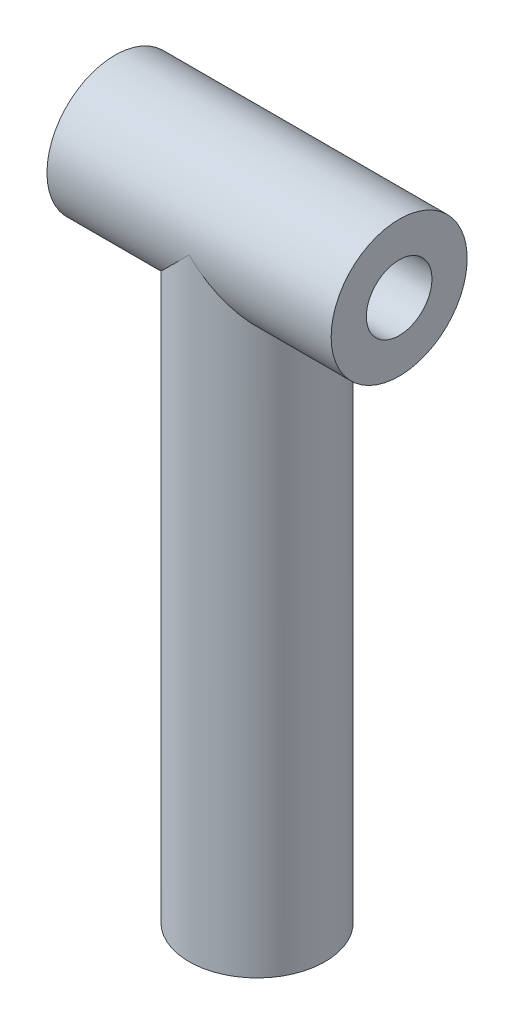
ISO-10303-21;
HEADER;
FILE_DESCRIPTION(('STEP AP214'),'2;1');
FILE_NAME('part.step','',(''),(''),'','','');
FILE_SCHEMA(('AUTOMOTIVE_DESIGN { 1 0 10303 214 1 1 1 1 }'));
ENDSEC;
DATA;
#1=APPLICATION_CONTEXT('core data for automotive mechanical design processes');
#2=APPLICATION_PROTOCOL_DEFINITION('international standard','automotive_design',2000,#1);
#3=PRODUCT_CONTEXT('',#1,'mechanical');
#4=PRODUCT('Part','Part','',(#3));
#5=PRODUCT_RELATED_PRODUCT_CATEGORY('part','',(#4));
#6=PRODUCT_DEFINITION_FORMATION('','',#4);
#7=PRODUCT_DEFINITION_CONTEXT('part definition',#1,'design');
#8=PRODUCT_DEFINITION('design','',#6,#7);
#9=PRODUCT_DEFINITION_SHAPE('','',#8);
#10=(LENGTH_UNIT() NAMED_UNIT(*) SI_UNIT(.MILLI.,.METRE.));
#11=(NAMED_UNIT(*) PLANE_ANGLE_UNIT() SI_UNIT($,.RADIAN.));
#12=(NAMED_UNIT(*) SI_UNIT($,.STERADIAN.) SOLID_ANGLE_UNIT());
#13=UNCERTAINTY_MEASURE_WITH_UNIT(LENGTH_MEASURE(1.E-05),#10,'distance_accuracy_value','');
#14=(GEOMETRIC_REPRESENTATION_CONTEXT(3) GLOBAL_UNCERTAINTY_ASSIGNED_CONTEXT((#13)) GLOBAL_UNIT_ASSIGNED_CONTEXT((#10,
#11,#12)) REPRESENTATION_CONTEXT('',''));
#15=CARTESIAN_POINT('',(0.,0.,0.));
#16=DIRECTION('',(0.,0.,1.));
#17=DIRECTION('',(1.,0.,0.));
#18=AXIS2_PLACEMENT_3D('',#15,#16,#17);
#19=CARTESIAN_POINT('',(0.,-112.,0.));
#20=DIRECTION('',(0.,1.,0.));
#21=DIRECTION('',(-1.,0.,0.));
#22=AXIS2_PLACEMENT_3D('',#19,#20,#21);
#23=CYLINDRICAL_SURFACE('',#22,5.);
#24=CARTESIAN_POINT('',(0.,-112.,0.));
#25=DIRECTION('',(0.,-1.,0.));
#26=DIRECTION('',(0.,0.,-1.));
#27=AXIS2_PLACEMENT_3D('',#24,#25,#26);
#28=CIRCLE('',#27,5.);
#29=CARTESIAN_POINT('',(0.,-112.,-5.));
#30=VERTEX_POINT('',#29);
#31=EDGE_CURVE('E95',#30,#30,#28,.T.);
#32=ORIENTED_EDGE('',*,*,#31,.T.);
#33=EDGE_LOOP('',(#32));
#34=FACE_BOUND('',#33,.T.);
#35=CARTESIAN_POINT('',(-5.,-12.445,0.));
#36=CARTESIAN_POINT('',(-4.99999921047016,-12.4449993836226,0.134380254248716));
#37=CARTESIAN_POINT('',(-4.99457509902374,-12.4428173961819,0.268811701853451));
#38=CARTESIAN_POINT('',(-4.97292780578597,-12.4341441176473,0.536722817996621));
#39=CARTESIAN_POINT('',(-4.95669745091969,-12.427649964189,0.67020179477194));
#40=CARTESIAN_POINT('',(-4.91355483179077,-12.4105057675391,0.935450702998557));
#41=CARTESIAN_POINT('',(-4.8866197706602,-12.399846855851,1.06721636325314));
#42=CARTESIAN_POINT('',(-4.82232747810782,-12.3746512557263,1.32785009255037));
#43=CARTESIAN_POINT('',(-4.78496598766992,-12.3601129827441,1.45671695418947));
#44=CARTESIAN_POINT('',(-4.70032985845046,-12.3275952396027,1.7101684260216));
#45=CARTESIAN_POINT('',(-4.65309264120023,-12.3096287814945,1.83476719187736));
#46=CARTESIAN_POINT('',(-4.54903318547114,-12.270672675897,2.079422416411));
#47=CARTESIAN_POINT('',(-4.49220736643891,-12.2496818995032,2.19947715769068));
#48=CARTESIAN_POINT('',(-4.30807871747373,-12.1829562937423,2.55155778451658));
#49=CARTESIAN_POINT('',(-4.16700669253554,-12.1334210621928,2.77585066122813));
#50=CARTESIAN_POINT('',(-3.84535504230426,-12.0266700031555,3.20764348432933));
#51=CARTESIAN_POINT('',(-3.66333069302464,-11.9692146605407,3.41399770947514));
#52=CARTESIAN_POINT('',(-3.26776469169965,-11.8541390779141,3.79432502613101));
#53=CARTESIAN_POINT('',(-3.05420759279374,-11.7965187707346,3.96828215238306));
#54=CARTESIAN_POINT('',(-2.70894461457719,-11.7133741209669,4.20503800338128));
#55=CARTESIAN_POINT('',(-2.58677461876584,-11.6856481327156,4.28128417227532));
#56=CARTESIAN_POINT('',(-2.33591639867659,-11.6326920062783,4.42314649094717));
#57=CARTESIAN_POINT('',(-2.20723088556697,-11.6074608426701,4.48876701520613));
#58=CARTESIAN_POINT('',(-1.94414888362959,-11.5603196732421,4.60881761007232));
#59=CARTESIAN_POINT('',(-1.80975202357346,-11.5384098837304,4.66324695192411));
#60=CARTESIAN_POINT('',(-1.53625430263286,-11.4986875533763,4.76035329833519));
#61=CARTESIAN_POINT('',(-1.39715584407928,-11.480872955296,4.80303620590282));
#62=CARTESIAN_POINT('',(-1.12164575793701,-11.4506865516449,4.8745503573854));
#63=CARTESIAN_POINT('',(-0.985397001964823,-11.438105076384,4.90392062765328));
#64=CARTESIAN_POINT('',(-0.710630029921596,-11.4177171072832,4.95120455235665));
#65=CARTESIAN_POINT('',(-0.572112870401013,-11.4099084519124,4.96912339312245));
#66=CARTESIAN_POINT('',(-0.293902004905635,-11.3993458489863,4.99330694472799));
#67=CARTESIAN_POINT('',(-0.154208559563968,-11.3965908098296,4.99957417236699));
#68=CARTESIAN_POINT('',(0.125215414153549,-11.3962357065788,5.00038379743066));
#69=CARTESIAN_POINT('',(0.264945940465497,-11.3986353989332,4.99492674880572));
#70=CARTESIAN_POINT('',(0.533442648235798,-11.4081493197636,4.97315593213459));
#71=CARTESIAN_POINT('',(0.662286374470261,-11.4149187002914,4.95763594217608));
#72=CARTESIAN_POINT('',(0.918140296182277,-11.4326161440291,4.91668689747132));
#73=CARTESIAN_POINT('',(1.04514987434996,-11.443545574999,4.89125458364115));
#74=CARTESIAN_POINT('',(1.29642210254544,-11.4692250850472,4.83073290249631));
#75=CARTESIAN_POINT('',(1.42068540270105,-11.4839742491317,4.79564584779066));
#76=CARTESIAN_POINT('',(1.66574422108091,-11.5168550359144,4.71613380674706));
#77=CARTESIAN_POINT('',(1.78653838578107,-11.5349879586816,4.67170523048239));
#78=CARTESIAN_POINT('',(2.14741152644033,-11.5945044599367,4.52295289096543));
#79=CARTESIAN_POINT('',(2.38103479478714,-11.6404713886928,4.40435783440319));
#80=CARTESIAN_POINT('',(2.82580554124556,-11.7395047901116,4.13313675238712));
#81=CARTESIAN_POINT('',(3.03694448669699,-11.7925739409039,3.98049787503238));
#82=CARTESIAN_POINT('',(3.44824147895701,-11.9048840812503,3.63151700800595));
#83=CARTESIAN_POINT('',(3.64625630498462,-11.9642834986836,3.4326938612438));
#84=CARTESIAN_POINT('',(4.00687795294106,-12.0790641038833,3.00388411082178));
#85=CARTESIAN_POINT('',(4.16947759813952,-12.1344444756944,2.77389120603769));
#86=CARTESIAN_POINT('',(4.3846237458889,-12.210584175859,2.40743959414935));
#87=CARTESIAN_POINT('',(4.45208797632575,-12.2350236946023,2.2802851101961));
#88=CARTESIAN_POINT('',(4.57598475336916,-12.2806487869271,2.02016868125749));
#89=CARTESIAN_POINT('',(4.63242181388257,-12.3018356911828,1.88720913992153));
#90=CARTESIAN_POINT('',(4.73371113281972,-12.3403343918904,1.6164394764204));
#91=CARTESIAN_POINT('',(4.77856568905935,-12.3576469568689,1.47863032252798));
#92=CARTESIAN_POINT('',(4.85623015201413,-12.3878857894599,1.19918765146139));
#93=CARTESIAN_POINT('',(4.8890409010387,-12.4008123638113,1.05755440247752));
#94=CARTESIAN_POINT('',(4.94064850647044,-12.4212522453434,0.780183727540194));
#95=CARTESIAN_POINT('',(4.96016632972264,-12.429043142911,0.644600511669063));
#96=CARTESIAN_POINT('',(4.98801976827636,-12.4401849641202,0.372057424985207));
#97=CARTESIAN_POINT('',(4.99635156606599,-12.4435343719872,0.235097100256941));
#98=CARTESIAN_POINT('',(5.00172546871138,-12.4456931048391,-0.0389960735936247));
#99=CARTESIAN_POINT('',(4.99877447047721,-12.4445052033758,-0.176128766112536));
#100=CARTESIAN_POINT('',(4.98162782933759,-12.4376275441603,-0.449626725995297));
#101=CARTESIAN_POINT('',(4.96742806364528,-12.4319361358284,-0.585991693521827));
#102=CARTESIAN_POINT('',(4.9288417825563,-12.4165699753529,-0.850630160306433));
#103=CARTESIAN_POINT('',(4.90495241461648,-12.4070899158576,-0.978987893973662));
#104=CARTESIAN_POINT('',(4.84729560993367,-12.384409464634,-1.23317359907332));
#105=CARTESIAN_POINT('',(4.81352471519742,-12.3712077705965,-1.35900066840996));
#106=CARTESIAN_POINT('',(4.73641864082605,-12.3414108302255,-1.60723969657171));
#107=CARTESIAN_POINT('',(4.69308623055802,-12.3248165666072,-1.72965263271533));
#108=CARTESIAN_POINT('',(4.59721862245418,-12.2886322829491,-1.97037922624301));
#109=CARTESIAN_POINT('',(4.5446799234358,-12.2690411235413,-2.08869130347873));
#110=CARTESIAN_POINT('',(4.37038023332567,-12.2051730672862,-2.44345163702831));
#111=CARTESIAN_POINT('',(4.23424428226286,-12.1567292019866,-2.67228894079636));
#112=CARTESIAN_POINT('',(3.92835596133021,-12.0536021212841,-3.10455772291127));
#113=CARTESIAN_POINT('',(3.75859005399423,-11.9989163970409,-3.30797891625889));
#114=CARTESIAN_POINT('',(3.3769936154928,-11.8847289464109,-3.69800092200719));
#115=CARTESIAN_POINT('',(3.16311467792,-11.8251490245893,-3.88257941482411));
#116=CARTESIAN_POINT('',(2.7062143316647,-11.711229692649,-4.21377636663199));
#117=CARTESIAN_POINT('',(2.4631879525536,-11.6568911791911,-4.36038833779732));
#118=CARTESIAN_POINT('',(2.08018132434987,-11.5840042253345,-4.54900696924889));
#119=CARTESIAN_POINT('',(1.9486469815508,-11.5610417255506,-4.60689727058004));
#120=CARTESIAN_POINT('',(1.68057173475836,-11.5188917332297,-4.71129845268958));
#121=CARTESIAN_POINT('',(1.54403303831837,-11.499702599383,-4.75781428320167));
#122=CARTESIAN_POINT('',(1.26699101422928,-11.4657923054734,-4.83896349754224));
#123=CARTESIAN_POINT('',(1.12648929693441,-11.4510693583889,-4.87360163462804));
#124=CARTESIAN_POINT('',(0.842590920923088,-11.4266354414021,-4.93061802310077));
#125=CARTESIAN_POINT('',(0.699194508690545,-11.41692404662,-4.95299731380356));
#126=CARTESIAN_POINT('',(0.421236724016027,-11.4034036797107,-4.98404171145953));
#127=CARTESIAN_POINT('',(0.286791210111257,-11.3992168265085,-4.99358579726783));
#128=CARTESIAN_POINT('',(0.0174554952301798,-11.3956217573602,-5.00178482832082));
#129=CARTESIAN_POINT('',(-0.117434839806553,-11.3962151451335,-5.00043611914974));
#130=CARTESIAN_POINT('',(-0.386490821886648,-11.4021628908075,-4.98685875641103));
#131=CARTESIAN_POINT('',(-0.520656799545218,-11.4075148519658,-4.97463557996516));
#132=CARTESIAN_POINT('',(-0.787356920060131,-11.4227939478067,-4.93945036446845));
#133=CARTESIAN_POINT('',(-0.919890428571075,-11.4327228067662,-4.91648427814056));
#134=CARTESIAN_POINT('',(-1.17696399303099,-11.4563328744432,-4.86120623466502));
#135=CARTESIAN_POINT('',(-1.30160977892854,-11.4698448125436,-4.8293129506677));
#136=CARTESIAN_POINT('',(-1.54769956790173,-11.5003677188003,-4.756167541315));
#137=CARTESIAN_POINT('',(-1.66914244331862,-11.5173799012246,-4.71491216764917));
#138=CARTESIAN_POINT('',(-2.02753552486303,-11.5729597606577,-4.57760125139047));
#139=CARTESIAN_POINT('',(-2.25873346268988,-11.6160886798235,-4.46796107341196));
#140=CARTESIAN_POINT('',(-2.71318935663733,-11.7126905388226,-4.20845602734986));
#141=CARTESIAN_POINT('',(-2.9352237603408,-11.7666160706689,-4.05663865533158));
#142=CARTESIAN_POINT('',(-3.35188508597662,-11.8774072256604,-3.71975268630043));
#143=CARTESIAN_POINT('',(-3.5465035811833,-11.9342737454555,-3.53467390545923));
#144=CARTESIAN_POINT('',(-3.82039083436652,-12.019368120646,-3.22878620888706));
#145=CARTESIAN_POINT('',(-3.91111058258957,-12.0485781529551,-3.11828305034802));
#146=CARTESIAN_POINT('',(-4.08291917786465,-12.1054403907438,-2.88966903065683));
#147=CARTESIAN_POINT('',(-4.16401149034221,-12.1330931548713,-2.77156093068234));
#148=CARTESIAN_POINT('',(-4.31603216169286,-12.1861017403326,-2.52833149185275));
#149=CARTESIAN_POINT('',(-4.38695093560296,-12.2114553873973,-2.40320369177869));
#150=CARTESIAN_POINT('',(-4.51791558839929,-12.259113625417,-2.1468899554537));
#151=CARTESIAN_POINT('',(-4.57796645185345,-12.2814196130252,-2.01570683130442));
#152=CARTESIAN_POINT('',(-4.68569232324595,-12.3219840767378,-1.75054233472229));
#153=CARTESIAN_POINT('',(-4.7335700284373,-12.3403079866013,-1.61665338433405));
#154=CARTESIAN_POINT('',(-4.81783289906416,-12.3728746875309,-1.34488373765286));
#155=CARTESIAN_POINT('',(-4.85422346888107,-12.3871193974549,-1.20700495189964));
#156=CARTESIAN_POINT('',(-4.91506943699304,-12.4110898918369,-0.928625220716791));
#157=CARTESIAN_POINT('',(-4.93955475551587,-12.4208270017918,-0.788131779803131));
#158=CARTESIAN_POINT('',(-4.9764322597395,-12.4355383497969,-0.50539113958929));
#159=CARTESIAN_POINT('',(-4.98883357202466,-12.4405161822924,-0.363145346129097));
#160=CARTESIAN_POINT('',(-4.99675263634713,-12.443695676603,-0.183898995686315));
#161=CARTESIAN_POINT('',(-4.99797012102503,-12.4441845802107,-0.147132531109212));
#162=CARTESIAN_POINT('',(-4.99959391085446,-12.4448368262554,-0.0735786568029208));
#163=CARTESIAN_POINT('',(-5.00000021616113,-12.4450001687546,-0.0367912470777395));
#164=CARTESIAN_POINT('',(-5.,-12.445,0.));
#165=B_SPLINE_CURVE_WITH_KNOTS('',3,(#35,#36,#37,#38,#39,#40,#41,#42,#43,#44,#45,#46,#47,#48,
#49,#50,#51,#52,#53,#54,#55,#56,#57,#58,#59,#60,#61,#62,#63,#64,#65,#66,#67,#68,#69,#70,#71,#72,
#73,#74,#75,#76,#77,#78,#79,#80,#81,#82,#83,#84,#85,#86,#87,#88,#89,#90,#91,#92,#93,#94,#95,#96,
#97,#98,#99,#100,#101,#102,#103,#104,#105,#106,#107,#108,#109,#110,#111,#112,#113,#114,#115,
#116,#117,#118,#119,#120,#121,#122,#123,#124,#125,#126,#127,#128,#129,#130,#131,#132,#133,#134,
#135,#136,#137,#138,#139,#140,#141,#142,#143,#144,#145,#146,#147,#148,#149,#150,#151,#152,#153,
#154,#155,#156,#157,#158,#159,#160,#161,#162,#163,#164),.UNSPECIFIED.,.T.,.F.,(4,2,2,2,2,2,2,2,
2,2,2,2,2,2,2,2,2,2,2,2,2,2,2,2,2,2,2,2,2,2,2,2,2,2,2,2,2,2,2,2,2,2,2,2,2,2,2,2,2,2,2,2,2,2,2,2,
2,2,2,2,2,2,2,2,4),(0.,0.403102977725288,0.806473798245664,1.21070828502652,1.6151081369131,
2.01800252629888,2.42104769787075,3.22603246277048,4.06582999775594,4.90604029532706,
5.3455496942421,5.78487768855411,6.22423428228731,6.66336967856714,7.0826502642342,
7.5017408237086,7.92074084727127,8.33972107429242,8.72911791721986,9.11864289851775,
9.5080746576351,9.89765634897667,10.6919920899354,11.4866282100969,12.3432846827139,
13.2001145918092,13.6376528658497,14.0750116592207,14.5122836196067,14.9495249926134,
15.3606076898873,15.7718306438157,16.182802266943,16.5939245850472,16.9861885745325,
17.3785899994409,17.7708779192796,18.1633153526093,18.9714400637709,19.7798907424474,
20.6421804680022,21.5046174469524,21.9407369433984,22.3766663182655,22.8124210372265,
23.2481388067961,23.6521699494815,24.056336645907,24.4602998916531,24.8644154489794,
25.2520743831579,25.6398680273374,26.4148965774801,27.2345477194313,28.0544502473573,
28.4917896894705,28.9289712295093,29.3665619908691,29.8039515397302,30.2334942605541,
30.6628345910938,31.0910902552057,31.5190222230333,31.6293856404158,31.7397490366914),.UNSPECIFIED.);
#166=CARTESIAN_POINT('',(-5.,-12.445,0.));
#167=VERTEX_POINT('',#166);
#168=EDGE_CURVE('E59',#167,#167,#165,.T.);
#169=ORIENTED_EDGE('',*,*,#168,.T.);
#170=EDGE_LOOP('',(#169));
#171=FACE_BOUND('',#170,.T.);
#172=ADVANCED_FACE('F54',(#34,#171),#23,.F.);
#173=CARTESIAN_POINT('',(0.,-112.,0.));
#174=DIRECTION('',(0.,1.,0.));
#175=DIRECTION('',(-1.,0.,0.));
#176=AXIS2_PLACEMENT_3D('',#173,#174,#175);
#177=CYLINDRICAL_SURFACE('',#176,12.445);
#178=CARTESIAN_POINT('',(0.,-112.,0.));
#179=DIRECTION('',(0.,-1.,0.));
#180=DIRECTION('',(0.,0.,-1.));
#181=AXIS2_PLACEMENT_3D('',#178,#179,#180);
#182=CIRCLE('',#181,12.445);
#183=CARTESIAN_POINT('',(0.,-112.,-12.445));
#184=VERTEX_POINT('',#183);
#185=EDGE_CURVE('E76',#184,#184,#182,.T.);
#186=ORIENTED_EDGE('',*,*,#185,.F.);
#187=EDGE_LOOP('',(#186));
#188=FACE_BOUND('',#187,.T.);
#189=CARTESIAN_POINT('',(0.,0.,0.));
#190=DIRECTION('',(-0.707106781186547,0.707106781186547,0.));
#191=DIRECTION('',(0.707106781186547,0.707106781186548,0.));
#192=AXIS2_PLACEMENT_3D('',#189,#190,#191);
#193=ELLIPSE('',#192,17.5998877837332,12.445);
#194=CARTESIAN_POINT('',(0.,0.,-12.445));
#195=VERTEX_POINT('',#194);
#196=CARTESIAN_POINT('',(0.,0.,12.445));
#197=VERTEX_POINT('',#196);
#198=EDGE_CURVE('E69',#195,#197,#193,.T.);
#199=ORIENTED_EDGE('',*,*,#198,.F.);
#200=CARTESIAN_POINT('',(0.,0.,0.));
#201=DIRECTION('',(0.707106781186547,0.707106781186548,0.));
#202=DIRECTION('',(-0.707106781186547,0.707106781186547,0.));
#203=AXIS2_PLACEMENT_3D('',#200,#201,#202);
#204=ELLIPSE('',#203,17.5998877837332,12.445);
#205=EDGE_CURVE('E13',#197,#195,#204,.T.);
#206=ORIENTED_EDGE('',*,*,#205,.F.);
#207=EDGE_LOOP('',(#199,#206));
#208=FACE_BOUND('',#207,.T.);
#209=ADVANCED_FACE('F78',(#188,#208),#177,.T.);
#210=CARTESIAN_POINT('',(0.,-112.,0.));
#211=DIRECTION('',(0.,-1.,0.));
#212=DIRECTION('',(0.,0.,-1.));
#213=AXIS2_PLACEMENT_3D('',#210,#211,#212);
#214=PLANE('',#213);
#215=ORIENTED_EDGE('',*,*,#31,.F.);
#216=EDGE_LOOP('',(#215));
#217=FACE_BOUND('',#216,.T.);
#218=ORIENTED_EDGE('',*,*,#185,.T.);
#219=EDGE_LOOP('',(#218));
#220=FACE_BOUND('',#219,.T.);
#221=ADVANCED_FACE('F80',(#217,#220),#214,.T.);
#222=CARTESIAN_POINT('',(26.,0.,0.));
#223=DIRECTION('',(-1.,0.,0.));
#224=DIRECTION('',(0.,0.,1.));
#225=AXIS2_PLACEMENT_3D('',#222,#223,#224);
#226=CYLINDRICAL_SURFACE('',#225,12.445);
#227=ORIENTED_EDGE('',*,*,#168,.F.);
#228=EDGE_LOOP('',(#227));
#229=FACE_BOUND('',#228,.T.);
#230=ORIENTED_EDGE('',*,*,#198,.T.);
#231=ORIENTED_EDGE('',*,*,#205,.T.);
#232=EDGE_LOOP('',(#230,#231));
#233=FACE_BOUND('',#232,.T.);
#234=ADVANCED_FACE('F56',(#229,#233),#226,.F.);
#235=CLOSED_SHELL('',(#172,#209,#221,#234));
#236=MANIFOLD_SOLID_BREP('B2',#235);
#237=CARTESIAN_POINT('',(26.,0.,0.));
#238=DIRECTION('',(-1.,0.,0.));
#239=DIRECTION('',(0.,0.,1.));
#240=AXIS2_PLACEMENT_3D('',#237,#238,#239);
#241=CYLINDRICAL_SURFACE('',#240,12.445);
#242=CARTESIAN_POINT('',(26.,0.,0.));
#243=DIRECTION('',(1.,0.,0.));
#244=DIRECTION('',(0.,0.,-1.));
#245=AXIS2_PLACEMENT_3D('',#242,#243,#244);
#246=CIRCLE('',#245,12.445);
#247=CARTESIAN_POINT('',(26.,0.,12.445));
#248=VERTEX_POINT('',#247);
#249=EDGE_CURVE('E53',#248,#248,#246,.T.);
#250=CARTESIAN_POINT('',(-26.,0.,0.));
#251=DIRECTION('',(1.,0.,0.));
#252=DIRECTION('',(0.,0.,-1.));
#253=AXIS2_PLACEMENT_3D('',#250,#251,#252);
#254=CIRCLE('',#253,12.445);
#255=CARTESIAN_POINT('',(-26.,0.,12.445));
#256=VERTEX_POINT('',#255);
#257=EDGE_CURVE('E156',#256,#256,#254,.T.);
#258=CARTESIAN_POINT('',(26.,0.,12.445));
#259=CARTESIAN_POINT('',(25.4583333333333,0.,12.445));
#260=CARTESIAN_POINT('',(24.9166666666667,0.,12.445));
#261=CARTESIAN_POINT('',(23.8333333333333,0.,12.445));
#262=CARTESIAN_POINT('',(23.2916666666667,0.,12.445));
#263=CARTESIAN_POINT('',(22.2083333333333,0.,12.445));
#264=CARTESIAN_POINT('',(21.6666666666667,0.,12.445));
#265=CARTESIAN_POINT('',(20.5833333333333,0.,12.445));
#266=CARTESIAN_POINT('',(20.0416666666667,0.,12.445));
#267=CARTESIAN_POINT('',(18.9583333333333,0.,12.445));
#268=CARTESIAN_POINT('',(18.4166666666667,0.,12.445));
#269=CARTESIAN_POINT('',(17.3333333333333,0.,12.445));
#270=CARTESIAN_POINT('',(16.7916666666667,0.,12.445));
#271=CARTESIAN_POINT('',(15.7083333333333,0.,12.445));
#272=CARTESIAN_POINT('',(15.1666666666667,0.,12.445));
#273=CARTESIAN_POINT('',(14.0833333333333,0.,12.445));
#274=CARTESIAN_POINT('',(13.5416666666667,0.,12.445));
#275=CARTESIAN_POINT('',(12.4583333333333,0.,12.445));
#276=CARTESIAN_POINT('',(11.9166666666667,0.,12.445));
#277=CARTESIAN_POINT('',(10.8333333333333,0.,12.445));
#278=CARTESIAN_POINT('',(10.2916666666667,0.,12.445));
#279=CARTESIAN_POINT('',(9.20833333333333,0.,12.445));
#280=CARTESIAN_POINT('',(8.66666666666666,0.,12.445));
#281=CARTESIAN_POINT('',(7.58333333333333,0.,12.445));
#282=CARTESIAN_POINT('',(7.04166666666666,0.,12.445));
#283=CARTESIAN_POINT('',(5.95833333333333,0.,12.445));
#284=CARTESIAN_POINT('',(5.41666666666666,0.,12.445));
#285=CARTESIAN_POINT('',(4.33333333333333,0.,12.445));
#286=CARTESIAN_POINT('',(3.79166666666666,0.,12.445));
#287=CARTESIAN_POINT('',(2.70833333333333,0.,12.445));
#288=CARTESIAN_POINT('',(2.16666666666666,0.,12.445));
#289=CARTESIAN_POINT('',(1.08333333333333,0.,12.445));
#290=CARTESIAN_POINT('',(0.541666666666664,0.,12.445));
#291=CARTESIAN_POINT('',(-0.54166666666667,0.,12.445));
#292=CARTESIAN_POINT('',(-1.08333333333334,0.,12.445));
#293=CARTESIAN_POINT('',(-2.16666666666667,0.,12.445));
#294=CARTESIAN_POINT('',(-2.70833333333334,0.,12.445));
#295=CARTESIAN_POINT('',(-3.79166666666667,0.,12.445));
#296=CARTESIAN_POINT('',(-4.33333333333334,0.,12.445));
#297=CARTESIAN_POINT('',(-5.41666666666667,0.,12.445));
#298=CARTESIAN_POINT('',(-5.95833333333333,0.,12.445));
#299=CARTESIAN_POINT('',(-7.04166666666666,0.,12.445));
#300=CARTESIAN_POINT('',(-7.58333333333333,0.,12.445));
#301=CARTESIAN_POINT('',(-8.66666666666666,0.,12.445));
#302=CARTESIAN_POINT('',(-9.20833333333333,0.,12.445));
#303=CARTESIAN_POINT('',(-10.2916666666667,0.,12.445));
#304=CARTESIAN_POINT('',(-10.8333333333333,0.,12.445));
#305=CARTESIAN_POINT('',(-11.9166666666667,0.,12.445));
#306=CARTESIAN_POINT('',(-12.4583333333333,0.,12.445));
#307=CARTESIAN_POINT('',(-13.5416666666667,0.,12.445));
#308=CARTESIAN_POINT('',(-14.0833333333333,0.,12.445));
#309=CARTESIAN_POINT('',(-15.1666666666667,0.,12.445));
#310=CARTESIAN_POINT('',(-15.7083333333333,0.,12.445));
#311=CARTESIAN_POINT('',(-16.7916666666667,0.,12.445));
#312=CARTESIAN_POINT('',(-17.3333333333333,0.,12.445));
#313=CARTESIAN_POINT('',(-18.4166666666667,0.,12.445));
#314=CARTESIAN_POINT('',(-18.9583333333333,0.,12.445));
#315=CARTESIAN_POINT('',(-20.0416666666667,0.,12.445));
#316=CARTESIAN_POINT('',(-20.5833333333333,0.,12.445));
#317=CARTESIAN_POINT('',(-21.6666666666667,0.,12.445));
#318=CARTESIAN_POINT('',(-22.2083333333333,0.,12.445));
#319=CARTESIAN_POINT('',(-23.2916666666667,0.,12.445));
#320=CARTESIAN_POINT('',(-23.8333333333333,0.,12.445));
#321=CARTESIAN_POINT('',(-24.9166666666667,0.,12.445));
#322=CARTESIAN_POINT('',(-25.4583333333333,0.,12.445));
#323=CARTESIAN_POINT('',(-26.,0.,12.445));
#324=B_SPLINE_CURVE_WITH_KNOTS('',3,(#258,#259,#260,#261,#262,#263,#264,#265,#266,#267,#268,
#269,#270,#271,#272,#273,#274,#275,#276,#277,#278,#279,#280,#281,#282,#283,#284,#285,#286,#287,
#288,#289,#290,#291,#292,#293,#294,#295,#296,#297,#298,#299,#300,#301,#302,#303,#304,#305,#306,
#307,#308,#309,#310,#311,#312,#313,#314,#315,#316,#317,#318,#319,#320,#321,#322,#323),
.UNSPECIFIED.,.F.,.F.,(4,2,2,2,2,2,2,2,2,2,2,2,2,2,2,2,2,2,2,2,2,2,2,2,2,2,2,2,2,2,2,2,4),(0.,
1.625,3.25,4.875,6.5,8.125,9.75,11.375,13.,14.625,16.25,17.875,19.5,21.125,22.75,24.375,26.,
27.625,29.25,30.875,32.5,34.125,35.75,37.375,39.,40.625,42.25,43.875,45.5,47.125,48.75,50.375,
52.),.UNSPECIFIED.);
#325=EDGE_CURVE('BSEAM153',#248,#256,#324,.T.);
#326=ORIENTED_EDGE('',*,*,#249,.F.);
#327=ORIENTED_EDGE('',*,*,#257,.T.);
#328=ORIENTED_EDGE('',*,*,#325,.T.);
#329=ORIENTED_EDGE('',*,*,#325,.F.);
#330=EDGE_LOOP('',(#326,#328,#327,#329));
#331=FACE_BOUND('',#330,.T.);
#332=ADVANCED_FACE('F153',(#331),#241,.T.);
#333=CARTESIAN_POINT('',(26.,0.,0.));
#334=DIRECTION('',(1.,0.,0.));
#335=DIRECTION('',(0.,0.,-1.));
#336=AXIS2_PLACEMENT_3D('',#333,#334,#335);
#337=PLANE('',#336);
#338=CARTESIAN_POINT('',(26.,0.,0.));
#339=DIRECTION('',(1.,0.,0.));
#340=DIRECTION('',(0.,0.,-1.));
#341=AXIS2_PLACEMENT_3D('',#338,#339,#340);
#342=CIRCLE('',#341,6.);
#343=CARTESIAN_POINT('',(26.,0.,6.));
#344=VERTEX_POINT('',#343);
#345=EDGE_CURVE('E163',#344,#344,#342,.T.);
#346=ORIENTED_EDGE('',*,*,#345,.F.);
#347=EDGE_LOOP('',(#346));
#348=FACE_BOUND('',#347,.T.);
#349=ORIENTED_EDGE('',*,*,#249,.T.);
#350=EDGE_LOOP('',(#349));
#351=FACE_BOUND('',#350,.T.);
#352=ADVANCED_FACE('F176',(#348,#351),#337,.T.);
#353=CARTESIAN_POINT('',(-26.,0.,0.));
#354=DIRECTION('',(1.,0.,0.));
#355=DIRECTION('',(0.,0.,-1.));
#356=AXIS2_PLACEMENT_3D('',#353,#354,#355);
#357=PLANE('',#356);
#358=CARTESIAN_POINT('',(-26.,0.,0.));
#359=DIRECTION('',(-1.,0.,0.));
#360=DIRECTION('',(0.,0.,1.));
#361=AXIS2_PLACEMENT_3D('',#358,#359,#360);
#362=CIRCLE('',#361,6.);
#363=CARTESIAN_POINT('',(-26.,0.,6.));
#364=VERTEX_POINT('',#363);
#365=EDGE_CURVE('E167',#364,#364,#362,.T.);
#366=ORIENTED_EDGE('',*,*,#365,.F.);
#367=EDGE_LOOP('',(#366));
#368=FACE_BOUND('',#367,.T.);
#369=ORIENTED_EDGE('',*,*,#257,.F.);
#370=EDGE_LOOP('',(#369));
#371=FACE_BOUND('',#370,.T.);
#372=ADVANCED_FACE('F173',(#368,#371),#357,.F.);
#373=CARTESIAN_POINT('',(31.,0.,0.));
#374=DIRECTION('',(-1.,0.,0.));
#375=DIRECTION('',(0.,0.,1.));
#376=AXIS2_PLACEMENT_3D('',#373,#374,#375);
#377=CYLINDRICAL_SURFACE('',#376,6.);
#378=CARTESIAN_POINT('',(26.,0.,6.));
#379=CARTESIAN_POINT('',(25.4583333333333,0.,6.));
#380=CARTESIAN_POINT('',(24.9166666666667,0.,6.));
#381=CARTESIAN_POINT('',(23.8333333333333,0.,6.));
#382=CARTESIAN_POINT('',(23.2916666666667,0.,6.));
#383=CARTESIAN_POINT('',(22.2083333333333,0.,6.));
#384=CARTESIAN_POINT('',(21.6666666666667,0.,6.));
#385=CARTESIAN_POINT('',(20.5833333333333,0.,6.));
#386=CARTESIAN_POINT('',(20.0416666666667,0.,6.));
#387=CARTESIAN_POINT('',(18.9583333333333,0.,6.));
#388=CARTESIAN_POINT('',(18.4166666666667,0.,6.));
#389=CARTESIAN_POINT('',(17.3333333333333,0.,6.));
#390=CARTESIAN_POINT('',(16.7916666666667,0.,6.));
#391=CARTESIAN_POINT('',(15.7083333333333,0.,6.));
#392=CARTESIAN_POINT('',(15.1666666666667,0.,6.));
#393=CARTESIAN_POINT('',(14.0833333333333,0.,6.));
#394=CARTESIAN_POINT('',(13.5416666666667,0.,6.));
#395=CARTESIAN_POINT('',(12.4583333333333,0.,6.));
#396=CARTESIAN_POINT('',(11.9166666666667,0.,6.));
#397=CARTESIAN_POINT('',(10.8333333333333,0.,6.));
#398=CARTESIAN_POINT('',(10.2916666666667,0.,6.));
#399=CARTESIAN_POINT('',(9.20833333333333,0.,6.));
#400=CARTESIAN_POINT('',(8.66666666666667,0.,6.));
#401=CARTESIAN_POINT('',(7.58333333333333,0.,6.));
#402=CARTESIAN_POINT('',(7.04166666666667,0.,6.));
#403=CARTESIAN_POINT('',(5.95833333333333,0.,6.));
#404=CARTESIAN_POINT('',(5.41666666666667,0.,6.));
#405=CARTESIAN_POINT('',(4.33333333333334,0.,6.));
#406=CARTESIAN_POINT('',(3.79166666666667,0.,6.));
#407=CARTESIAN_POINT('',(2.70833333333334,0.,6.));
#408=CARTESIAN_POINT('',(2.16666666666667,0.,6.));
#409=CARTESIAN_POINT('',(1.08333333333333,0.,6.));
#410=CARTESIAN_POINT('',(0.541666666666667,0.,6.));
#411=CARTESIAN_POINT('',(-0.541666666666666,0.,6.));
#412=CARTESIAN_POINT('',(-1.08333333333333,0.,6.));
#413=CARTESIAN_POINT('',(-2.16666666666666,0.,6.));
#414=CARTESIAN_POINT('',(-2.70833333333333,0.,6.));
#415=CARTESIAN_POINT('',(-3.79166666666666,0.,6.));
#416=CARTESIAN_POINT('',(-4.33333333333333,0.,6.));
#417=CARTESIAN_POINT('',(-5.41666666666666,0.,6.));
#418=CARTESIAN_POINT('',(-5.95833333333333,0.,6.));
#419=CARTESIAN_POINT('',(-7.04166666666666,0.,6.));
#420=CARTESIAN_POINT('',(-7.58333333333333,0.,6.));
#421=CARTESIAN_POINT('',(-8.66666666666666,0.,6.));
#422=CARTESIAN_POINT('',(-9.20833333333332,0.,6.));
#423=CARTESIAN_POINT('',(-10.2916666666667,0.,6.));
#424=CARTESIAN_POINT('',(-10.8333333333333,0.,6.));
#425=CARTESIAN_POINT('',(-11.9166666666667,0.,6.));
#426=CARTESIAN_POINT('',(-12.4583333333333,0.,6.));
#427=CARTESIAN_POINT('',(-13.5416666666667,0.,6.));
#428=CARTESIAN_POINT('',(-14.0833333333333,0.,6.));
#429=CARTESIAN_POINT('',(-15.1666666666667,0.,6.));
#430=CARTESIAN_POINT('',(-15.7083333333333,0.,6.));
#431=CARTESIAN_POINT('',(-16.7916666666667,0.,6.));
#432=CARTESIAN_POINT('',(-17.3333333333333,0.,6.));
#433=CARTESIAN_POINT('',(-18.4166666666667,0.,6.));
#434=CARTESIAN_POINT('',(-18.9583333333333,0.,6.));
#435=CARTESIAN_POINT('',(-20.0416666666667,0.,6.));
#436=CARTESIAN_POINT('',(-20.5833333333333,0.,6.));
#437=CARTESIAN_POINT('',(-21.6666666666667,0.,6.));
#438=CARTESIAN_POINT('',(-22.2083333333333,0.,6.));
#439=CARTESIAN_POINT('',(-23.2916666666667,0.,6.));
#440=CARTESIAN_POINT('',(-23.8333333333333,0.,6.));
#441=CARTESIAN_POINT('',(-24.9166666666667,0.,6.));
#442=CARTESIAN_POINT('',(-25.4583333333333,0.,6.));
#443=CARTESIAN_POINT('',(-26.,0.,6.));
#444=B_SPLINE_CURVE_WITH_KNOTS('',3,(#378,#379,#380,#381,#382,#383,#384,#385,#386,#387,#388,
#389,#390,#391,#392,#393,#394,#395,#396,#397,#398,#399,#400,#401,#402,#403,#404,#405,#406,#407,
#408,#409,#410,#411,#412,#413,#414,#415,#416,#417,#418,#419,#420,#421,#422,#423,#424,#425,#426,
#427,#428,#429,#430,#431,#432,#433,#434,#435,#436,#437,#438,#439,#440,#441,#442,#443),
.UNSPECIFIED.,.F.,.F.,(4,2,2,2,2,2,2,2,2,2,2,2,2,2,2,2,2,2,2,2,2,2,2,2,2,2,2,2,2,2,2,2,4),(0.,
1.625,3.25,4.875,6.5,8.125,9.75,11.375,13.,14.625,16.25,17.875,19.5,21.125,22.75,24.375,26.,
27.625,29.25,30.875,32.5,34.125,35.75,37.375,39.,40.625,42.25,43.875,45.5,47.125,48.75,50.375,
52.),.UNSPECIFIED.);
#445=EDGE_CURVE('BSEAM171',#344,#364,#444,.T.);
#446=ORIENTED_EDGE('',*,*,#345,.T.);
#447=ORIENTED_EDGE('',*,*,#365,.T.);
#448=ORIENTED_EDGE('',*,*,#445,.T.);
#449=ORIENTED_EDGE('',*,*,#445,.F.);
#450=EDGE_LOOP('',(#446,#448,#447,#449));
#451=FACE_BOUND('',#450,.T.);
#452=ADVANCED_FACE('F171',(#451),#377,.F.);
#453=CLOSED_SHELL('',(#332,#352,#372,#452));
#454=MANIFOLD_SOLID_BREP('B7',#453);
#455=ADVANCED_BREP_SHAPE_REPRESENTATION('',(#18,#236,#454),#14);
#456=SHAPE_DEFINITION_REPRESENTATION(#9,#455);
ENDSEC;
END-ISO-10303-21;
